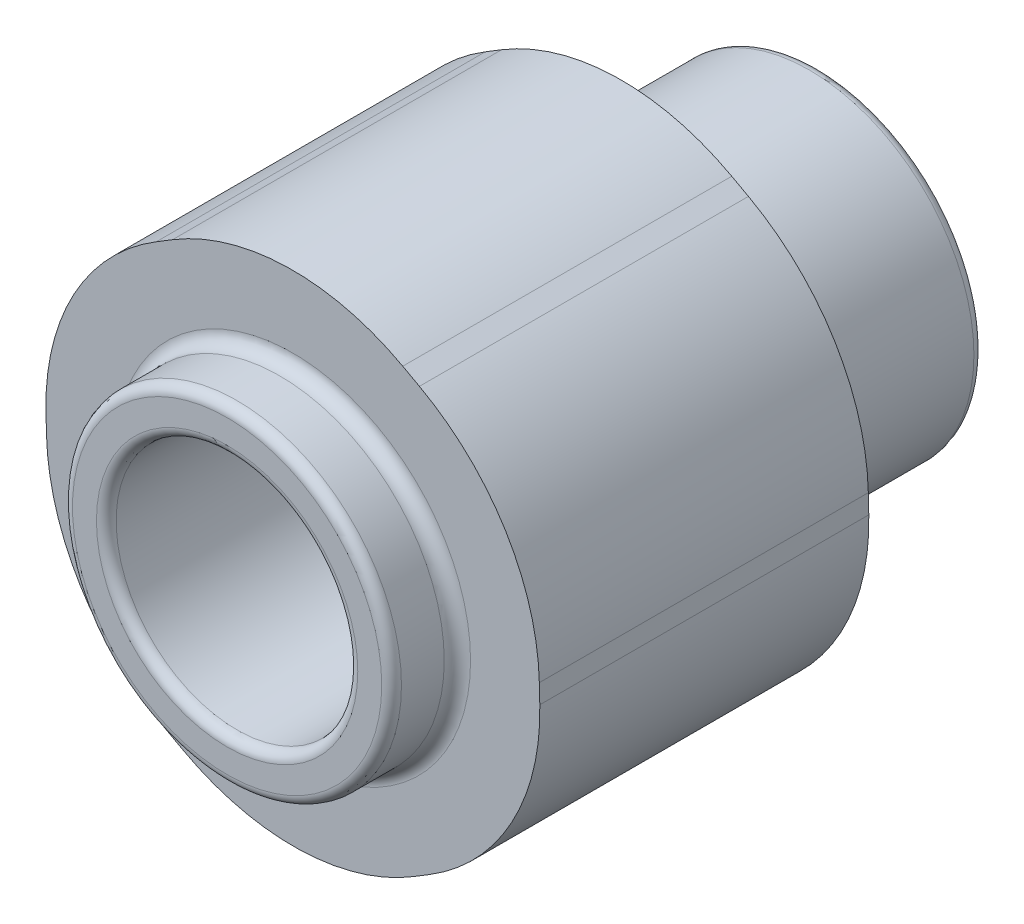
ISO-10303-21;
HEADER;
FILE_DESCRIPTION(('STEP AP214'),'2;1');
FILE_NAME('part.step','',(''),(''),'','','');
FILE_SCHEMA(('AUTOMOTIVE_DESIGN { 1 0 10303 214 1 1 1 1 }'));
ENDSEC;
DATA;
#1=APPLICATION_CONTEXT('core data for automotive mechanical design processes');
#2=APPLICATION_PROTOCOL_DEFINITION('international standard','automotive_design',2000,#1);
#3=PRODUCT_CONTEXT('',#1,'mechanical');
#4=PRODUCT('Part','Part','',(#3));
#5=PRODUCT_RELATED_PRODUCT_CATEGORY('part','',(#4));
#6=PRODUCT_DEFINITION_FORMATION('','',#4);
#7=PRODUCT_DEFINITION_CONTEXT('part definition',#1,'design');
#8=PRODUCT_DEFINITION('design','',#6,#7);
#9=PRODUCT_DEFINITION_SHAPE('','',#8);
#10=(LENGTH_UNIT() NAMED_UNIT(*) SI_UNIT(.MILLI.,.METRE.));
#11=(NAMED_UNIT(*) PLANE_ANGLE_UNIT() SI_UNIT($,.RADIAN.));
#12=(NAMED_UNIT(*) SI_UNIT($,.STERADIAN.) SOLID_ANGLE_UNIT());
#13=UNCERTAINTY_MEASURE_WITH_UNIT(LENGTH_MEASURE(1.E-05),#10,'distance_accuracy_value','');
#14=(GEOMETRIC_REPRESENTATION_CONTEXT(3) GLOBAL_UNCERTAINTY_ASSIGNED_CONTEXT((#13)) GLOBAL_UNIT_ASSIGNED_CONTEXT((#10,
#11,#12)) REPRESENTATION_CONTEXT('',''));
#15=CARTESIAN_POINT('',(0.,0.,0.));
#16=DIRECTION('',(0.,0.,1.));
#17=DIRECTION('',(1.,0.,0.));
#18=AXIS2_PLACEMENT_3D('',#15,#16,#17);
#19=CARTESIAN_POINT('',(7.60215696331241,-4.1481573626323,10.));
#20=DIRECTION('',(-0.99970967332691,-0.0240950006557903,0.));
#21=DIRECTION('',(0.0240950006557903,-0.99970967332691,0.));
#22=AXIS2_PLACEMENT_3D('',#19,#20,#21);
#23=PLANE('',#22);
#24=DIRECTION('',(-0.0240950006557903,0.99970967332691,0.));
#25=VECTOR('',#24,1.);
#26=CARTESIAN_POINT('',(7.60215696331241,-4.1481573626323,0.));
#27=LINE('',#26,#25);
#28=CARTESIAN_POINT('',(7.5047781775092,-0.107878819584952,0.));
#29=VERTEX_POINT('',#28);
#30=CARTESIAN_POINT('',(7.49086692239445,0.46930382942181,0.));
#31=VERTEX_POINT('',#30);
#32=EDGE_CURVE('E157',#29,#31,#27,.T.);
#33=ORIENTED_EDGE('',*,*,#32,.T.);
#34=DIRECTION('',(0.,0.,-1.));
#35=VECTOR('',#34,1.);
#36=CARTESIAN_POINT('',(7.49086692239445,0.46930382942181,10.));
#37=LINE('',#36,#35);
#38=CARTESIAN_POINT('',(7.49086692239445,0.46930382942181,10.));
#39=VERTEX_POINT('',#38);
#40=EDGE_CURVE('E135',#31,#39,#37,.F.);
#41=ORIENTED_EDGE('',*,*,#40,.T.);
#42=DIRECTION('',(-0.0240950006557903,0.99970967332691,0.));
#43=VECTOR('',#42,1.);
#44=CARTESIAN_POINT('',(7.60215696331241,-4.1481573626323,10.));
#45=LINE('',#44,#43);
#46=CARTESIAN_POINT('',(7.5047781775092,-0.107878819584952,10.));
#47=VERTEX_POINT('',#46);
#48=EDGE_CURVE('E171',#47,#39,#45,.T.);
#49=ORIENTED_EDGE('',*,*,#48,.F.);
#50=DIRECTION('',(0.,0.,-1.));
#51=VECTOR('',#50,1.);
#52=CARTESIAN_POINT('',(7.5047781775092,-0.107878819584952,10.));
#53=LINE('',#52,#51);
#54=EDGE_CURVE('E139',#47,#29,#53,.T.);
#55=ORIENTED_EDGE('',*,*,#54,.T.);
#56=EDGE_LOOP('',(#33,#41,#49,#55));
#57=FACE_BOUND('',#56,.T.);
#58=ADVANCED_FACE('F39',(#57),#23,.F.);
#59=CARTESIAN_POINT('',(7.39348813659124,4.50958237246916,10.));
#60=DIRECTION('',(-0.478987953991338,-0.877821473838042,0.));
#61=DIRECTION('',(0.877821473838042,-0.478987953991338,0.));
#62=AXIS2_PLACEMENT_3D('',#59,#60,#61);
#63=PLANE('',#62);
#64=DIRECTION('',(-0.877821473838042,0.478987953991338,0.));
#65=VECTOR('',#64,1.);
#66=CARTESIAN_POINT('',(7.39348813659124,4.50958237246916,10.));
#67=LINE('',#66,#65);
#68=CARTESIAN_POINT('',(3.84581488704545,6.44538914169757,10.));
#69=VERTEX_POINT('',#68);
#70=CARTESIAN_POINT('',(3.33900442282462,6.72193296587306,10.));
#71=VERTEX_POINT('',#70);
#72=EDGE_CURVE('E146',#69,#71,#67,.T.);
#73=ORIENTED_EDGE('',*,*,#72,.F.);
#74=DIRECTION('',(0.,0.,-1.));
#75=VECTOR('',#74,1.);
#76=CARTESIAN_POINT('',(3.84581488704545,6.44538914169757,10.));
#77=LINE('',#76,#75);
#78=CARTESIAN_POINT('',(3.84581488704545,6.44538914169757,0.));
#79=VERTEX_POINT('',#78);
#80=EDGE_CURVE('E132',#69,#79,#77,.T.);
#81=ORIENTED_EDGE('',*,*,#80,.T.);
#82=DIRECTION('',(-0.877821473838042,0.478987953991338,0.));
#83=VECTOR('',#82,1.);
#84=CARTESIAN_POINT('',(7.39348813659124,4.50958237246916,0.));
#85=LINE('',#84,#83);
#86=CARTESIAN_POINT('',(3.33900442282462,6.72193296587306,0.));
#87=VERTEX_POINT('',#86);
#88=EDGE_CURVE('E147',#79,#87,#85,.T.);
#89=ORIENTED_EDGE('',*,*,#88,.T.);
#90=DIRECTION('',(0.,0.,-1.));
#91=VECTOR('',#90,1.);
#92=CARTESIAN_POINT('',(3.33900442282462,6.72193296587306,10.));
#93=LINE('',#92,#91);
#94=EDGE_CURVE('E153',#87,#71,#93,.F.);
#95=ORIENTED_EDGE('',*,*,#94,.T.);
#96=EDGE_LOOP('',(#73,#81,#89,#95));
#97=FACE_BOUND('',#96,.T.);
#98=ADVANCED_FACE('F143',(#97),#63,.F.);
#99=CARTESIAN_POINT('',(-0.208668826721172,8.65773973510147,10.));
#100=DIRECTION('',(0.520721719335572,-0.853726473182251,0.));
#101=DIRECTION('',(0.853726473182251,0.520721719335572,0.));
#102=AXIS2_PLACEMENT_3D('',#99,#100,#101);
#103=PLANE('',#102);
#104=DIRECTION('',(-0.853726473182251,-0.520721719335572,0.));
#105=VECTOR('',#104,1.);
#106=CARTESIAN_POINT('',(-0.208668826721172,8.65773973510147,0.));
#107=LINE('',#106,#105);
#108=CARTESIAN_POINT('',(-3.65896329046375,6.55326796128252,0.));
#109=VERTEX_POINT('',#108);
#110=CARTESIAN_POINT('',(-4.15186249956984,6.25262913645125,0.));
#111=VERTEX_POINT('',#110);
#112=EDGE_CURVE('E151',#109,#111,#107,.T.);
#113=ORIENTED_EDGE('',*,*,#112,.T.);
#114=DIRECTION('',(0.,0.,-1.));
#115=VECTOR('',#114,1.);
#116=CARTESIAN_POINT('',(-4.15186249956983,6.25262913645125,10.));
#117=LINE('',#116,#115);
#118=CARTESIAN_POINT('',(-4.15186249956984,6.25262913645125,10.));
#119=VERTEX_POINT('',#118);
#120=EDGE_CURVE('E11',#111,#119,#117,.F.);
#121=ORIENTED_EDGE('',*,*,#120,.T.);
#122=DIRECTION('',(-0.853726473182251,-0.520721719335572,0.));
#123=VECTOR('',#122,1.);
#124=CARTESIAN_POINT('',(-0.208668826721172,8.65773973510147,10.));
#125=LINE('',#124,#123);
#126=CARTESIAN_POINT('',(-3.65896329046375,6.55326796128252,10.));
#127=VERTEX_POINT('',#126);
#128=EDGE_CURVE('E255',#127,#119,#125,.T.);
#129=ORIENTED_EDGE('',*,*,#128,.F.);
#130=DIRECTION('',(0.,0.,-1.));
#131=VECTOR('',#130,1.);
#132=CARTESIAN_POINT('',(-3.65896329046375,6.55326796128252,10.));
#133=LINE('',#132,#131);
#134=EDGE_CURVE('E50',#127,#109,#133,.T.);
#135=ORIENTED_EDGE('',*,*,#134,.T.);
#136=EDGE_LOOP('',(#113,#121,#129,#135));
#137=FACE_BOUND('',#136,.T.);
#138=ADVANCED_FACE('F248',(#137),#103,.F.);
#139=CARTESIAN_POINT('',(-7.60215696331241,4.1481573626323,10.));
#140=DIRECTION('',(0.99970967332691,0.0240950006557905,0.));
#141=DIRECTION('',(-0.0240950006557905,0.99970967332691,0.));
#142=AXIS2_PLACEMENT_3D('',#139,#140,#141);
#143=PLANE('',#142);
#144=DIRECTION('',(0.0240950006557905,-0.99970967332691,0.));
#145=VECTOR('',#144,1.);
#146=CARTESIAN_POINT('',(-7.60215696331241,4.1481573626323,0.));
#147=LINE('',#146,#145);
#148=CARTESIAN_POINT('',(-7.5047781775092,0.107878819584952,0.));
#149=VERTEX_POINT('',#148);
#150=CARTESIAN_POINT('',(-7.49086692239445,-0.469303829421809,0.));
#151=VERTEX_POINT('',#150);
#152=EDGE_CURVE('E159',#149,#151,#147,.T.);
#153=ORIENTED_EDGE('',*,*,#152,.T.);
#154=DIRECTION('',(0.,0.,-1.));
#155=VECTOR('',#154,1.);
#156=CARTESIAN_POINT('',(-7.49086692239445,-0.469303829421809,10.));
#157=LINE('',#156,#155);
#158=CARTESIAN_POINT('',(-7.49086692239445,-0.469303829421809,10.));
#159=VERTEX_POINT('',#158);
#160=EDGE_CURVE('E242',#151,#159,#157,.F.);
#161=ORIENTED_EDGE('',*,*,#160,.T.);
#162=DIRECTION('',(0.0240950006557905,-0.99970967332691,0.));
#163=VECTOR('',#162,1.);
#164=CARTESIAN_POINT('',(-7.60215696331241,4.1481573626323,10.));
#165=LINE('',#164,#163);
#166=CARTESIAN_POINT('',(-7.5047781775092,0.107878819584952,10.));
#167=VERTEX_POINT('',#166);
#168=EDGE_CURVE('E261',#167,#159,#165,.T.);
#169=ORIENTED_EDGE('',*,*,#168,.F.);
#170=DIRECTION('',(0.,0.,-1.));
#171=VECTOR('',#170,1.);
#172=CARTESIAN_POINT('',(-7.5047781775092,0.107878819584952,10.));
#173=LINE('',#172,#171);
#174=EDGE_CURVE('E241',#167,#149,#173,.T.);
#175=ORIENTED_EDGE('',*,*,#174,.T.);
#176=EDGE_LOOP('',(#153,#161,#169,#175));
#177=FACE_BOUND('',#176,.T.);
#178=ADVANCED_FACE('F264',(#177),#143,.F.);
#179=CARTESIAN_POINT('',(-7.39348813659124,-4.50958237246916,10.));
#180=DIRECTION('',(0.478987953991338,0.877821473838042,0.));
#181=DIRECTION('',(-0.877821473838042,0.478987953991338,0.));
#182=AXIS2_PLACEMENT_3D('',#179,#180,#181);
#183=PLANE('',#182);
#184=DIRECTION('',(0.877821473838042,-0.478987953991338,0.));
#185=VECTOR('',#184,1.);
#186=CARTESIAN_POINT('',(-7.39348813659124,-4.50958237246916,0.));
#187=LINE('',#186,#185);
#188=CARTESIAN_POINT('',(-3.84581488704545,-6.44538914169757,0.));
#189=VERTEX_POINT('',#188);
#190=CARTESIAN_POINT('',(-3.33900442282462,-6.72193296587306,0.));
#191=VERTEX_POINT('',#190);
#192=EDGE_CURVE('E168',#189,#191,#187,.T.);
#193=ORIENTED_EDGE('',*,*,#192,.T.);
#194=DIRECTION('',(0.,0.,-1.));
#195=VECTOR('',#194,1.);
#196=CARTESIAN_POINT('',(-3.33900442282462,-6.72193296587306,10.));
#197=LINE('',#196,#195);
#198=CARTESIAN_POINT('',(-3.33900442282462,-6.72193296587306,10.));
#199=VERTEX_POINT('',#198);
#200=EDGE_CURVE('E237',#191,#199,#197,.F.);
#201=ORIENTED_EDGE('',*,*,#200,.T.);
#202=DIRECTION('',(0.877821473838042,-0.478987953991338,0.));
#203=VECTOR('',#202,1.);
#204=CARTESIAN_POINT('',(-7.39348813659124,-4.50958237246916,10.));
#205=LINE('',#204,#203);
#206=CARTESIAN_POINT('',(-3.84581488704545,-6.44538914169757,10.));
#207=VERTEX_POINT('',#206);
#208=EDGE_CURVE('E270',#207,#199,#205,.T.);
#209=ORIENTED_EDGE('',*,*,#208,.F.);
#210=DIRECTION('',(0.,0.,-1.));
#211=VECTOR('',#210,1.);
#212=CARTESIAN_POINT('',(-3.84581488704545,-6.44538914169757,10.));
#213=LINE('',#212,#211);
#214=EDGE_CURVE('E236',#207,#189,#213,.T.);
#215=ORIENTED_EDGE('',*,*,#214,.T.);
#216=EDGE_LOOP('',(#193,#201,#209,#215));
#217=FACE_BOUND('',#216,.T.);
#218=ADVANCED_FACE('F288',(#217),#183,.F.);
#219=CARTESIAN_POINT('',(0.208668826721172,-8.65773973510147,10.));
#220=DIRECTION('',(-0.520721719335572,0.853726473182251,0.));
#221=DIRECTION('',(-0.853726473182251,-0.520721719335572,0.));
#222=AXIS2_PLACEMENT_3D('',#219,#220,#221);
#223=PLANE('',#222);
#224=DIRECTION('',(0.853726473182251,0.520721719335572,0.));
#225=VECTOR('',#224,1.);
#226=CARTESIAN_POINT('',(0.208668826721172,-8.65773973510147,0.));
#227=LINE('',#226,#225);
#228=CARTESIAN_POINT('',(3.65896329046375,-6.55326796128252,0.));
#229=VERTEX_POINT('',#228);
#230=CARTESIAN_POINT('',(4.15186249956983,-6.25262913645124,0.));
#231=VERTEX_POINT('',#230);
#232=EDGE_CURVE('E169',#229,#231,#227,.T.);
#233=ORIENTED_EDGE('',*,*,#232,.T.);
#234=DIRECTION('',(0.,0.,-1.));
#235=VECTOR('',#234,1.);
#236=CARTESIAN_POINT('',(4.15186249956983,-6.25262913645125,10.));
#237=LINE('',#236,#235);
#238=CARTESIAN_POINT('',(4.15186249956983,-6.25262913645124,10.));
#239=VERTEX_POINT('',#238);
#240=EDGE_CURVE('E53',#231,#239,#237,.F.);
#241=ORIENTED_EDGE('',*,*,#240,.T.);
#242=DIRECTION('',(0.853726473182251,0.520721719335572,0.));
#243=VECTOR('',#242,1.);
#244=CARTESIAN_POINT('',(0.208668826721172,-8.65773973510147,10.));
#245=LINE('',#244,#243);
#246=CARTESIAN_POINT('',(3.65896329046375,-6.55326796128252,10.));
#247=VERTEX_POINT('',#246);
#248=EDGE_CURVE('E176',#247,#239,#245,.T.);
#249=ORIENTED_EDGE('',*,*,#248,.F.);
#250=DIRECTION('',(0.,0.,-1.));
#251=VECTOR('',#250,1.);
#252=CARTESIAN_POINT('',(3.65896329046375,-6.55326796128252,10.));
#253=LINE('',#252,#251);
#254=EDGE_CURVE('E235',#247,#229,#253,.T.);
#255=ORIENTED_EDGE('',*,*,#254,.T.);
#256=EDGE_LOOP('',(#233,#241,#249,#255));
#257=FACE_BOUND('',#256,.T.);
#258=ADVANCED_FACE('F284',(#257),#223,.F.);
#259=CARTESIAN_POINT('',(0.,0.,10.));
#260=DIRECTION('',(0.,0.,1.));
#261=DIRECTION('',(1.,0.,0.));
#262=AXIS2_PLACEMENT_3D('',#259,#260,#261);
#263=PLANE('',#262);
#264=CARTESIAN_POINT('',(0.,0.,10.));
#265=DIRECTION('',(0.,0.,1.));
#266=DIRECTION('',(1.,0.,0.));
#267=AXIS2_PLACEMENT_3D('',#264,#265,#266);
#268=CIRCLE('',#267,5.4);
#269=CARTESIAN_POINT('',(5.4,0.,10.));
#270=VERTEX_POINT('',#269);
#271=EDGE_CURVE('E185',#270,#270,#268,.F.);
#272=ORIENTED_EDGE('',*,*,#271,.T.);
#273=EDGE_LOOP('',(#272));
#274=FACE_BOUND('',#273,.T.);
#275=ORIENTED_EDGE('',*,*,#48,.T.);
#276=CARTESIAN_POINT('',(0.492899209106081,0.300638824831278,10.));
#277=DIRECTION('',(0.,0.,1.));
#278=DIRECTION('',(1.,0.,0.));
#279=AXIS2_PLACEMENT_3D('',#276,#277,#278);
#280=CIRCLE('',#279,7.);
#281=EDGE_CURVE('E229',#39,#69,#280,.T.);
#282=ORIENTED_EDGE('',*,*,#281,.T.);
#283=ORIENTED_EDGE('',*,*,#72,.T.);
#284=CARTESIAN_POINT('',(-0.013911255114745,0.577182649006764,10.));
#285=DIRECTION('',(0.,0.,1.));
#286=DIRECTION('',(1.,0.,0.));
#287=AXIS2_PLACEMENT_3D('',#284,#285,#286);
#288=CIRCLE('',#287,7.);
#289=EDGE_CURVE('E222',#71,#127,#288,.T.);
#290=ORIENTED_EDGE('',*,*,#289,.T.);
#291=ORIENTED_EDGE('',*,*,#128,.T.);
#292=CARTESIAN_POINT('',(-0.506810464220827,0.276543824175486,10.));
#293=DIRECTION('',(0.,0.,1.));
#294=DIRECTION('',(1.,0.,0.));
#295=AXIS2_PLACEMENT_3D('',#292,#293,#294);
#296=CIRCLE('',#295,7.);
#297=EDGE_CURVE('E223',#119,#167,#296,.T.);
#298=ORIENTED_EDGE('',*,*,#297,.T.);
#299=ORIENTED_EDGE('',*,*,#168,.T.);
#300=CARTESIAN_POINT('',(-0.492899209106082,-0.300638824831275,10.));
#301=DIRECTION('',(0.,0.,1.));
#302=DIRECTION('',(1.,0.,0.));
#303=AXIS2_PLACEMENT_3D('',#300,#301,#302);
#304=CIRCLE('',#303,7.);
#305=EDGE_CURVE('E221',#159,#207,#304,.T.);
#306=ORIENTED_EDGE('',*,*,#305,.T.);
#307=ORIENTED_EDGE('',*,*,#208,.T.);
#308=CARTESIAN_POINT('',(0.013911255114745,-0.577182649006761,10.));
#309=DIRECTION('',(0.,0.,1.));
#310=DIRECTION('',(1.,0.,0.));
#311=AXIS2_PLACEMENT_3D('',#308,#309,#310);
#312=CIRCLE('',#311,7.);
#313=EDGE_CURVE('E62',#199,#247,#312,.T.);
#314=ORIENTED_EDGE('',*,*,#313,.T.);
#315=ORIENTED_EDGE('',*,*,#248,.T.);
#316=CARTESIAN_POINT('',(0.506810464220826,-0.276543824175485,10.));
#317=DIRECTION('',(0.,0.,1.));
#318=DIRECTION('',(1.,0.,0.));
#319=AXIS2_PLACEMENT_3D('',#316,#317,#318);
#320=CIRCLE('',#319,7.);
#321=EDGE_CURVE('E226',#239,#47,#320,.T.);
#322=ORIENTED_EDGE('',*,*,#321,.T.);
#323=EDGE_LOOP('',(#275,#282,#283,#290,#291,#298,#299,#306,#307,#314,#315,#322));
#324=FACE_BOUND('',#323,.T.);
#325=ADVANCED_FACE('F274',(#274,#324),#263,.T.);
#326=CARTESIAN_POINT('',(0.,0.,0.));
#327=DIRECTION('',(0.,0.,1.));
#328=DIRECTION('',(1.,0.,0.));
#329=AXIS2_PLACEMENT_3D('',#326,#327,#328);
#330=PLANE('',#329);
#331=CARTESIAN_POINT('',(0.,0.,0.));
#332=DIRECTION('',(0.,0.,1.));
#333=DIRECTION('',(1.,0.,0.));
#334=AXIS2_PLACEMENT_3D('',#331,#332,#333);
#335=CIRCLE('',#334,5.4);
#336=CARTESIAN_POINT('',(5.4,0.,0.));
#337=VERTEX_POINT('',#336);
#338=EDGE_CURVE('E174',#337,#337,#335,.T.);
#339=ORIENTED_EDGE('',*,*,#338,.T.);
#340=EDGE_LOOP('',(#339));
#341=FACE_BOUND('',#340,.T.);
#342=ORIENTED_EDGE('',*,*,#88,.F.);
#343=CARTESIAN_POINT('',(0.492899209106081,0.300638824831278,0.));
#344=DIRECTION('',(0.,0.,1.));
#345=DIRECTION('',(1.,0.,0.));
#346=AXIS2_PLACEMENT_3D('',#343,#344,#345);
#347=CIRCLE('',#346,7.);
#348=EDGE_CURVE('E126',#79,#31,#347,.F.);
#349=ORIENTED_EDGE('',*,*,#348,.T.);
#350=ORIENTED_EDGE('',*,*,#32,.F.);
#351=CARTESIAN_POINT('',(0.506810464220826,-0.276543824175485,0.));
#352=DIRECTION('',(0.,0.,1.));
#353=DIRECTION('',(1.,0.,0.));
#354=AXIS2_PLACEMENT_3D('',#351,#352,#353);
#355=CIRCLE('',#354,7.);
#356=EDGE_CURVE('E136',#29,#231,#355,.F.);
#357=ORIENTED_EDGE('',*,*,#356,.T.);
#358=ORIENTED_EDGE('',*,*,#232,.F.);
#359=CARTESIAN_POINT('',(0.013911255114745,-0.577182649006761,0.));
#360=DIRECTION('',(0.,0.,1.));
#361=DIRECTION('',(1.,0.,0.));
#362=AXIS2_PLACEMENT_3D('',#359,#360,#361);
#363=CIRCLE('',#362,7.);
#364=EDGE_CURVE('E213',#229,#191,#363,.F.);
#365=ORIENTED_EDGE('',*,*,#364,.T.);
#366=ORIENTED_EDGE('',*,*,#192,.F.);
#367=CARTESIAN_POINT('',(-0.492899209106082,-0.300638824831275,0.));
#368=DIRECTION('',(0.,0.,1.));
#369=DIRECTION('',(1.,0.,0.));
#370=AXIS2_PLACEMENT_3D('',#367,#368,#369);
#371=CIRCLE('',#370,7.);
#372=EDGE_CURVE('E214',#189,#151,#371,.F.);
#373=ORIENTED_EDGE('',*,*,#372,.T.);
#374=ORIENTED_EDGE('',*,*,#152,.F.);
#375=CARTESIAN_POINT('',(-0.506810464220827,0.276543824175486,0.));
#376=DIRECTION('',(0.,0.,1.));
#377=DIRECTION('',(1.,0.,0.));
#378=AXIS2_PLACEMENT_3D('',#375,#376,#377);
#379=CIRCLE('',#378,7.);
#380=EDGE_CURVE('E212',#149,#111,#379,.F.);
#381=ORIENTED_EDGE('',*,*,#380,.T.);
#382=ORIENTED_EDGE('',*,*,#112,.F.);
#383=CARTESIAN_POINT('',(-0.013911255114745,0.577182649006764,0.));
#384=DIRECTION('',(0.,0.,1.));
#385=DIRECTION('',(1.,0.,0.));
#386=AXIS2_PLACEMENT_3D('',#383,#384,#385);
#387=CIRCLE('',#386,7.);
#388=EDGE_CURVE('E148',#109,#87,#387,.F.);
#389=ORIENTED_EDGE('',*,*,#388,.T.);
#390=EDGE_LOOP('',(#342,#349,#350,#357,#358,#365,#366,#373,#374,#381,#382,#389));
#391=FACE_BOUND('',#390,.T.);
#392=ADVANCED_FACE('F152',(#341,#391),#330,.F.);
#393=CARTESIAN_POINT('',(0.,0.,-6.));
#394=DIRECTION('',(0.,0.,1.));
#395=DIRECTION('',(1.,0.,0.));
#396=AXIS2_PLACEMENT_3D('',#393,#394,#395);
#397=CYLINDRICAL_SURFACE('',#396,5.);
#398=CARTESIAN_POINT('',(0.,0.,-5.7));
#399=DIRECTION('',(0.,0.,-1.));
#400=DIRECTION('',(-1.,0.,0.));
#401=AXIS2_PLACEMENT_3D('',#398,#399,#400);
#402=CIRCLE('',#401,5.);
#403=CARTESIAN_POINT('',(-5.,0.,-5.7));
#404=VERTEX_POINT('',#403);
#405=EDGE_CURVE('E199',#404,#404,#402,.F.);
#406=ORIENTED_EDGE('',*,*,#405,.T.);
#407=EDGE_LOOP('',(#406));
#408=FACE_BOUND('',#407,.T.);
#409=CARTESIAN_POINT('',(0.,0.,-0.4));
#410=DIRECTION('',(0.,0.,1.));
#411=DIRECTION('',(1.,0.,0.));
#412=AXIS2_PLACEMENT_3D('',#409,#410,#411);
#413=CIRCLE('',#412,5.);
#414=CARTESIAN_POINT('',(5.,0.,-0.4));
#415=VERTEX_POINT('',#414);
#416=EDGE_CURVE('E175',#415,#415,#413,.F.);
#417=ORIENTED_EDGE('',*,*,#416,.T.);
#418=EDGE_LOOP('',(#417));
#419=FACE_BOUND('',#418,.T.);
#420=ADVANCED_FACE('F434',(#408,#419),#397,.T.);
#421=CARTESIAN_POINT('',(0.,0.,-6.));
#422=DIRECTION('',(0.,0.,-1.));
#423=DIRECTION('',(-1.,0.,0.));
#424=AXIS2_PLACEMENT_3D('',#421,#422,#423);
#425=PLANE('',#424);
#426=CARTESIAN_POINT('',(0.,0.,-6.));
#427=DIRECTION('',(0.,0.,-1.));
#428=DIRECTION('',(-1.,0.,0.));
#429=AXIS2_PLACEMENT_3D('',#426,#427,#428);
#430=CIRCLE('',#429,3.97200105968366);
#431=CARTESIAN_POINT('',(-3.97200105968366,0.,-6.));
#432=VERTEX_POINT('',#431);
#433=EDGE_CURVE('E189',#432,#432,#430,.F.);
#434=ORIENTED_EDGE('',*,*,#433,.T.);
#435=EDGE_LOOP('',(#434));
#436=FACE_BOUND('',#435,.T.);
#437=CARTESIAN_POINT('',(0.,0.,-6.));
#438=DIRECTION('',(0.,0.,-1.));
#439=DIRECTION('',(-1.,0.,0.));
#440=AXIS2_PLACEMENT_3D('',#437,#438,#439);
#441=CIRCLE('',#440,4.7);
#442=CARTESIAN_POINT('',(-4.7,0.,-6.));
#443=VERTEX_POINT('',#442);
#444=EDGE_CURVE('E184',#443,#443,#441,.T.);
#445=ORIENTED_EDGE('',*,*,#444,.T.);
#446=EDGE_LOOP('',(#445));
#447=FACE_BOUND('',#446,.T.);
#448=ADVANCED_FACE('F312',(#436,#447),#425,.T.);
#449=CARTESIAN_POINT('',(0.,0.,-0.4));
#450=DIRECTION('',(0.,0.,1.));
#451=DIRECTION('',(1.,0.,0.));
#452=AXIS2_PLACEMENT_3D('',#449,#450,#451);
#453=TOROIDAL_SURFACE('',#452,5.4,0.4);
#454=ORIENTED_EDGE('',*,*,#338,.F.);
#455=EDGE_LOOP('',(#454));
#456=FACE_BOUND('',#455,.T.);
#457=ORIENTED_EDGE('',*,*,#416,.F.);
#458=EDGE_LOOP('',(#457));
#459=FACE_BOUND('',#458,.T.);
#460=ADVANCED_FACE('F307',(#456,#459),#453,.F.);
#461=CARTESIAN_POINT('',(0.,0.,12.));
#462=DIRECTION('',(0.,0.,-1.));
#463=DIRECTION('',(-1.,0.,0.));
#464=AXIS2_PLACEMENT_3D('',#461,#462,#463);
#465=CYLINDRICAL_SURFACE('',#464,5.);
#466=CARTESIAN_POINT('',(0.,0.,11.7));
#467=DIRECTION('',(0.,0.,1.));
#468=DIRECTION('',(1.,0.,0.));
#469=AXIS2_PLACEMENT_3D('',#466,#467,#468);
#470=CIRCLE('',#469,5.);
#471=CARTESIAN_POINT('',(5.,0.,11.7));
#472=VERTEX_POINT('',#471);
#473=EDGE_CURVE('E207',#472,#472,#470,.F.);
#474=ORIENTED_EDGE('',*,*,#473,.T.);
#475=EDGE_LOOP('',(#474));
#476=FACE_BOUND('',#475,.T.);
#477=CARTESIAN_POINT('',(0.,0.,10.4));
#478=DIRECTION('',(0.,0.,1.));
#479=DIRECTION('',(1.,0.,0.));
#480=AXIS2_PLACEMENT_3D('',#477,#478,#479);
#481=CIRCLE('',#480,5.);
#482=CARTESIAN_POINT('',(5.,0.,10.4));
#483=VERTEX_POINT('',#482);
#484=EDGE_CURVE('E177',#483,#483,#481,.T.);
#485=ORIENTED_EDGE('',*,*,#484,.T.);
#486=EDGE_LOOP('',(#485));
#487=FACE_BOUND('',#486,.T.);
#488=ADVANCED_FACE('F315',(#476,#487),#465,.T.);
#489=CARTESIAN_POINT('',(0.,0.,12.));
#490=DIRECTION('',(0.,0.,1.));
#491=DIRECTION('',(1.,0.,0.));
#492=AXIS2_PLACEMENT_3D('',#489,#490,#491);
#493=PLANE('',#492);
#494=CARTESIAN_POINT('',(0.,0.,12.));
#495=DIRECTION('',(0.,0.,1.));
#496=DIRECTION('',(1.,0.,0.));
#497=AXIS2_PLACEMENT_3D('',#494,#495,#496);
#498=CIRCLE('',#497,3.97200105968366);
#499=CARTESIAN_POINT('',(3.97200105968366,0.,12.));
#500=VERTEX_POINT('',#499);
#501=EDGE_CURVE('E203',#500,#500,#498,.F.);
#502=ORIENTED_EDGE('',*,*,#501,.T.);
#503=EDGE_LOOP('',(#502));
#504=FACE_BOUND('',#503,.T.);
#505=CARTESIAN_POINT('',(0.,0.,12.));
#506=DIRECTION('',(0.,0.,1.));
#507=DIRECTION('',(1.,0.,0.));
#508=AXIS2_PLACEMENT_3D('',#505,#506,#507);
#509=CIRCLE('',#508,4.7);
#510=CARTESIAN_POINT('',(4.7,0.,12.));
#511=VERTEX_POINT('',#510);
#512=EDGE_CURVE('E196',#511,#511,#509,.T.);
#513=ORIENTED_EDGE('',*,*,#512,.T.);
#514=EDGE_LOOP('',(#513));
#515=FACE_BOUND('',#514,.T.);
#516=ADVANCED_FACE('F316',(#504,#515),#493,.T.);
#517=CARTESIAN_POINT('',(0.,0.,10.4));
#518=DIRECTION('',(0.,0.,1.));
#519=DIRECTION('',(1.,0.,0.));
#520=AXIS2_PLACEMENT_3D('',#517,#518,#519);
#521=TOROIDAL_SURFACE('',#520,5.4,0.4);
#522=ORIENTED_EDGE('',*,*,#271,.F.);
#523=EDGE_LOOP('',(#522));
#524=FACE_BOUND('',#523,.T.);
#525=ORIENTED_EDGE('',*,*,#484,.F.);
#526=EDGE_LOOP('',(#525));
#527=FACE_BOUND('',#526,.T.);
#528=ADVANCED_FACE('F314',(#524,#527),#521,.F.);
#529=CARTESIAN_POINT('',(0.,0.,-6.));
#530=DIRECTION('',(0.,0.,1.));
#531=DIRECTION('',(1.,0.,0.));
#532=AXIS2_PLACEMENT_3D('',#529,#530,#531);
#533=CYLINDRICAL_SURFACE('',#532,3.67200105968366);
#534=CARTESIAN_POINT('',(0.,0.,-5.7));
#535=DIRECTION('',(0.,0.,-1.));
#536=DIRECTION('',(-1.,0.,0.));
#537=AXIS2_PLACEMENT_3D('',#534,#535,#536);
#538=CIRCLE('',#537,3.67200105968366);
#539=CARTESIAN_POINT('',(-3.67200105968366,0.,-5.7));
#540=VERTEX_POINT('',#539);
#541=EDGE_CURVE('E191',#540,#540,#538,.T.);
#542=ORIENTED_EDGE('',*,*,#541,.T.);
#543=EDGE_LOOP('',(#542));
#544=FACE_BOUND('',#543,.T.);
#545=CARTESIAN_POINT('',(0.,0.,11.7));
#546=DIRECTION('',(0.,0.,1.));
#547=DIRECTION('',(1.,0.,0.));
#548=AXIS2_PLACEMENT_3D('',#545,#546,#547);
#549=CIRCLE('',#548,3.67200105968366);
#550=CARTESIAN_POINT('',(3.67200105968366,0.,11.7));
#551=VERTEX_POINT('',#550);
#552=EDGE_CURVE('E192',#551,#551,#549,.T.);
#553=ORIENTED_EDGE('',*,*,#552,.T.);
#554=EDGE_LOOP('',(#553));
#555=FACE_BOUND('',#554,.T.);
#556=ADVANCED_FACE('F319',(#544,#555),#533,.F.);
#557=CARTESIAN_POINT('',(0.,0.,-5.7));
#558=DIRECTION('',(0.,0.,-1.));
#559=DIRECTION('',(-1.,0.,0.));
#560=AXIS2_PLACEMENT_3D('',#557,#558,#559);
#561=TOROIDAL_SURFACE('',#560,3.97200105968366,0.3);
#562=ORIENTED_EDGE('',*,*,#541,.F.);
#563=EDGE_LOOP('',(#562));
#564=FACE_BOUND('',#563,.T.);
#565=ORIENTED_EDGE('',*,*,#433,.F.);
#566=EDGE_LOOP('',(#565));
#567=FACE_BOUND('',#566,.T.);
#568=ADVANCED_FACE('F322',(#564,#567),#561,.T.);
#569=CARTESIAN_POINT('',(0.,0.,-5.7));
#570=DIRECTION('',(0.,0.,-1.));
#571=DIRECTION('',(-1.,0.,0.));
#572=AXIS2_PLACEMENT_3D('',#569,#570,#571);
#573=TOROIDAL_SURFACE('',#572,4.7,0.3);
#574=ORIENTED_EDGE('',*,*,#405,.F.);
#575=EDGE_LOOP('',(#574));
#576=FACE_BOUND('',#575,.T.);
#577=ORIENTED_EDGE('',*,*,#444,.F.);
#578=EDGE_LOOP('',(#577));
#579=FACE_BOUND('',#578,.T.);
#580=ADVANCED_FACE('F321',(#576,#579),#573,.T.);
#581=CARTESIAN_POINT('',(0.,0.,11.7));
#582=DIRECTION('',(0.,0.,1.));
#583=DIRECTION('',(1.,0.,0.));
#584=AXIS2_PLACEMENT_3D('',#581,#582,#583);
#585=TOROIDAL_SURFACE('',#584,3.97200105968366,0.3);
#586=ORIENTED_EDGE('',*,*,#501,.F.);
#587=EDGE_LOOP('',(#586));
#588=FACE_BOUND('',#587,.T.);
#589=ORIENTED_EDGE('',*,*,#552,.F.);
#590=EDGE_LOOP('',(#589));
#591=FACE_BOUND('',#590,.T.);
#592=ADVANCED_FACE('F327',(#588,#591),#585,.T.);
#593=CARTESIAN_POINT('',(0.,0.,11.7));
#594=DIRECTION('',(0.,0.,1.));
#595=DIRECTION('',(1.,0.,0.));
#596=AXIS2_PLACEMENT_3D('',#593,#594,#595);
#597=TOROIDAL_SURFACE('',#596,4.7,0.3);
#598=ORIENTED_EDGE('',*,*,#473,.F.);
#599=EDGE_LOOP('',(#598));
#600=FACE_BOUND('',#599,.T.);
#601=ORIENTED_EDGE('',*,*,#512,.F.);
#602=EDGE_LOOP('',(#601));
#603=FACE_BOUND('',#602,.T.);
#604=ADVANCED_FACE('F335',(#600,#603),#597,.T.);
#605=CARTESIAN_POINT('',(0.492899209106081,0.300638824831278,10.));
#606=DIRECTION('',(0.,0.,-1.));
#607=DIRECTION('',(-1.,0.,0.));
#608=AXIS2_PLACEMENT_3D('',#605,#606,#607);
#609=CYLINDRICAL_SURFACE('',#608,7.);
#610=ORIENTED_EDGE('',*,*,#281,.F.);
#611=ORIENTED_EDGE('',*,*,#40,.F.);
#612=ORIENTED_EDGE('',*,*,#348,.F.);
#613=ORIENTED_EDGE('',*,*,#80,.F.);
#614=EDGE_LOOP('',(#610,#611,#612,#613));
#615=FACE_BOUND('',#614,.T.);
#616=ADVANCED_FACE('F134',(#615),#609,.T.);
#617=CARTESIAN_POINT('',(0.506810464220826,-0.276543824175485,10.));
#618=DIRECTION('',(0.,0.,-1.));
#619=DIRECTION('',(-1.,0.,0.));
#620=AXIS2_PLACEMENT_3D('',#617,#618,#619);
#621=CYLINDRICAL_SURFACE('',#620,7.);
#622=ORIENTED_EDGE('',*,*,#321,.F.);
#623=ORIENTED_EDGE('',*,*,#240,.F.);
#624=ORIENTED_EDGE('',*,*,#356,.F.);
#625=ORIENTED_EDGE('',*,*,#54,.F.);
#626=EDGE_LOOP('',(#622,#623,#624,#625));
#627=FACE_BOUND('',#626,.T.);
#628=ADVANCED_FACE('F276',(#627),#621,.T.);
#629=CARTESIAN_POINT('',(0.013911255114745,-0.577182649006761,10.));
#630=DIRECTION('',(0.,0.,-1.));
#631=DIRECTION('',(-1.,0.,0.));
#632=AXIS2_PLACEMENT_3D('',#629,#630,#631);
#633=CYLINDRICAL_SURFACE('',#632,7.);
#634=ORIENTED_EDGE('',*,*,#313,.F.);
#635=ORIENTED_EDGE('',*,*,#200,.F.);
#636=ORIENTED_EDGE('',*,*,#364,.F.);
#637=ORIENTED_EDGE('',*,*,#254,.F.);
#638=EDGE_LOOP('',(#634,#635,#636,#637));
#639=FACE_BOUND('',#638,.T.);
#640=ADVANCED_FACE('F285',(#639),#633,.T.);
#641=CARTESIAN_POINT('',(-0.492899209106082,-0.300638824831275,10.));
#642=DIRECTION('',(0.,0.,-1.));
#643=DIRECTION('',(-1.,0.,0.));
#644=AXIS2_PLACEMENT_3D('',#641,#642,#643);
#645=CYLINDRICAL_SURFACE('',#644,7.);
#646=ORIENTED_EDGE('',*,*,#305,.F.);
#647=ORIENTED_EDGE('',*,*,#160,.F.);
#648=ORIENTED_EDGE('',*,*,#372,.F.);
#649=ORIENTED_EDGE('',*,*,#214,.F.);
#650=EDGE_LOOP('',(#646,#647,#648,#649));
#651=FACE_BOUND('',#650,.T.);
#652=ADVANCED_FACE('F292',(#651),#645,.T.);
#653=CARTESIAN_POINT('',(-0.506810464220827,0.276543824175486,10.));
#654=DIRECTION('',(0.,0.,-1.));
#655=DIRECTION('',(-1.,0.,0.));
#656=AXIS2_PLACEMENT_3D('',#653,#654,#655);
#657=CYLINDRICAL_SURFACE('',#656,7.);
#658=ORIENTED_EDGE('',*,*,#297,.F.);
#659=ORIENTED_EDGE('',*,*,#120,.F.);
#660=ORIENTED_EDGE('',*,*,#380,.F.);
#661=ORIENTED_EDGE('',*,*,#174,.F.);
#662=EDGE_LOOP('',(#658,#659,#660,#661));
#663=FACE_BOUND('',#662,.T.);
#664=ADVANCED_FACE('F256',(#663),#657,.T.);
#665=CARTESIAN_POINT('',(-0.013911255114745,0.577182649006764,10.));
#666=DIRECTION('',(0.,0.,-1.));
#667=DIRECTION('',(-1.,0.,0.));
#668=AXIS2_PLACEMENT_3D('',#665,#666,#667);
#669=CYLINDRICAL_SURFACE('',#668,7.);
#670=ORIENTED_EDGE('',*,*,#289,.F.);
#671=ORIENTED_EDGE('',*,*,#94,.F.);
#672=ORIENTED_EDGE('',*,*,#388,.F.);
#673=ORIENTED_EDGE('',*,*,#134,.F.);
#674=EDGE_LOOP('',(#670,#671,#672,#673));
#675=FACE_BOUND('',#674,.T.);
#676=ADVANCED_FACE('F41',(#675),#669,.T.);
#677=CLOSED_SHELL('',(#58,#98,#138,#178,#218,#258,#325,#392,#420,#448,#460,#488,#516,#528,#556,
#568,#580,#592,#604,#616,#628,#640,#652,#664,#676));
#678=MANIFOLD_SOLID_BREP('B2',#677);
#679=ADVANCED_BREP_SHAPE_REPRESENTATION('',(#18,#678),#14);
#680=SHAPE_DEFINITION_REPRESENTATION(#9,#679);
ENDSEC;
END-ISO-10303-21;
